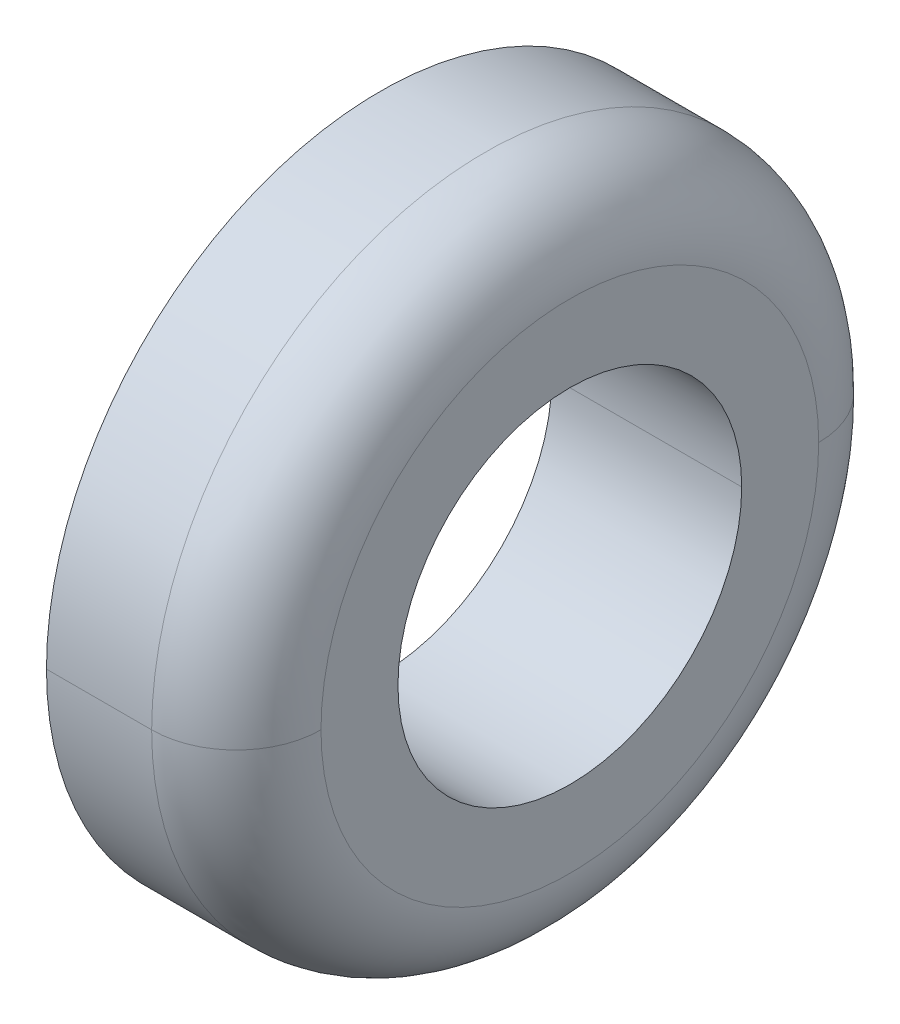
ISO-10303-21;
HEADER;
FILE_DESCRIPTION(('STEP AP214'),'2;1');
FILE_NAME('part.step','',(''),(''),'','','');
FILE_SCHEMA(('AUTOMOTIVE_DESIGN { 1 0 10303 214 1 1 1 1 }'));
ENDSEC;
DATA;
#1=APPLICATION_CONTEXT('core data for automotive mechanical design processes');
#2=APPLICATION_PROTOCOL_DEFINITION('international standard','automotive_design',2000,#1);
#3=PRODUCT_CONTEXT('',#1,'mechanical');
#4=PRODUCT('Part','Part','',(#3));
#5=PRODUCT_RELATED_PRODUCT_CATEGORY('part','',(#4));
#6=PRODUCT_DEFINITION_FORMATION('','',#4);
#7=PRODUCT_DEFINITION_CONTEXT('part definition',#1,'design');
#8=PRODUCT_DEFINITION('design','',#6,#7);
#9=PRODUCT_DEFINITION_SHAPE('','',#8);
#10=(LENGTH_UNIT() NAMED_UNIT(*) SI_UNIT(.MILLI.,.METRE.));
#11=(NAMED_UNIT(*) PLANE_ANGLE_UNIT() SI_UNIT($,.RADIAN.));
#12=(NAMED_UNIT(*) SI_UNIT($,.STERADIAN.) SOLID_ANGLE_UNIT());
#13=UNCERTAINTY_MEASURE_WITH_UNIT(LENGTH_MEASURE(1.E-05),#10,'distance_accuracy_value','');
#14=(GEOMETRIC_REPRESENTATION_CONTEXT(3) GLOBAL_UNCERTAINTY_ASSIGNED_CONTEXT((#13)) GLOBAL_UNIT_ASSIGNED_CONTEXT((#10,
#11,#12)) REPRESENTATION_CONTEXT('',''));
#15=CARTESIAN_POINT('',(0.,0.,0.));
#16=DIRECTION('',(0.,0.,1.));
#17=DIRECTION('',(1.,0.,0.));
#18=AXIS2_PLACEMENT_3D('',#15,#16,#17);
#19=CARTESIAN_POINT('',(0.,0.,0.));
#20=DIRECTION('',(-1.,0.,0.));
#21=DIRECTION('',(0.,0.,1.));
#22=AXIS2_PLACEMENT_3D('',#19,#20,#21);
#23=CYLINDRICAL_SURFACE('',#22,1.675);
#24=DIRECTION('',(1.,0.,0.));
#25=VECTOR('',#24,1.);
#26=CARTESIAN_POINT('',(2.9,0.,-1.675));
#27=LINE('',#26,#25);
#28=CARTESIAN_POINT('',(2.9,0.,-1.675));
#29=VERTEX_POINT('',#28);
#30=CARTESIAN_POINT('',(4.75,0.,-1.675));
#31=VERTEX_POINT('',#30);
#32=EDGE_CURVE('E24',#29,#31,#27,.T.);
#33=ORIENTED_EDGE('',*,*,#32,.F.);
#34=CARTESIAN_POINT('',(2.9,0.,0.));
#35=DIRECTION('',(1.,0.,0.));
#36=DIRECTION('',(0.,0.,1.));
#37=AXIS2_PLACEMENT_3D('',#34,#35,#36);
#38=CIRCLE('',#37,1.675);
#39=CARTESIAN_POINT('',(2.9,0.,1.675));
#40=VERTEX_POINT('',#39);
#41=EDGE_CURVE('E85',#40,#29,#38,.T.);
#42=ORIENTED_EDGE('',*,*,#41,.F.);
#43=DIRECTION('',(1.,0.,0.));
#44=VECTOR('',#43,1.);
#45=CARTESIAN_POINT('',(2.9,0.,1.675));
#46=LINE('',#45,#44);
#47=CARTESIAN_POINT('',(4.75,0.,1.675));
#48=VERTEX_POINT('',#47);
#49=EDGE_CURVE('E11',#40,#48,#46,.T.);
#50=ORIENTED_EDGE('',*,*,#49,.T.);
#51=CARTESIAN_POINT('',(4.75,0.,0.));
#52=DIRECTION('',(-1.,0.,0.));
#53=DIRECTION('',(0.,0.,-1.));
#54=AXIS2_PLACEMENT_3D('',#51,#52,#53);
#55=CIRCLE('',#54,1.675);
#56=EDGE_CURVE('E100',#31,#48,#55,.T.);
#57=ORIENTED_EDGE('',*,*,#56,.F.);
#58=EDGE_LOOP('',(#33,#42,#50,#57));
#59=FACE_BOUND('',#58,.T.);
#60=ADVANCED_FACE('F17',(#59),#23,.F.);
#61=CARTESIAN_POINT('',(0.,0.,0.));
#62=DIRECTION('',(-1.,0.,0.));
#63=DIRECTION('',(0.,0.,1.));
#64=AXIS2_PLACEMENT_3D('',#61,#62,#63);
#65=CYLINDRICAL_SURFACE('',#64,1.675);
#66=CARTESIAN_POINT('',(4.75,0.,0.));
#67=DIRECTION('',(-1.,0.,0.));
#68=DIRECTION('',(0.,0.,1.));
#69=AXIS2_PLACEMENT_3D('',#66,#67,#68);
#70=CIRCLE('',#69,1.675);
#71=EDGE_CURVE('E94',#48,#31,#70,.T.);
#72=ORIENTED_EDGE('',*,*,#71,.F.);
#73=ORIENTED_EDGE('',*,*,#49,.F.);
#74=CARTESIAN_POINT('',(2.9,0.,0.));
#75=DIRECTION('',(1.,0.,0.));
#76=DIRECTION('',(0.,0.,-1.));
#77=AXIS2_PLACEMENT_3D('',#74,#75,#76);
#78=CIRCLE('',#77,1.675);
#79=EDGE_CURVE('E74',#29,#40,#78,.T.);
#80=ORIENTED_EDGE('',*,*,#79,.F.);
#81=ORIENTED_EDGE('',*,*,#32,.T.);
#82=EDGE_LOOP('',(#72,#73,#80,#81));
#83=FACE_BOUND('',#82,.T.);
#84=ADVANCED_FACE('F92',(#83),#65,.F.);
#85=CARTESIAN_POINT('',(2.9,1.675,0.));
#86=DIRECTION('',(1.,0.,0.));
#87=DIRECTION('',(0.,0.,-1.));
#88=AXIS2_PLACEMENT_3D('',#85,#86,#87);
#89=PLANE('',#88);
#90=ORIENTED_EDGE('',*,*,#41,.T.);
#91=ORIENTED_EDGE('',*,*,#79,.T.);
#92=EDGE_LOOP('',(#90,#91));
#93=FACE_BOUND('',#92,.T.);
#94=CARTESIAN_POINT('',(2.9,0.,0.));
#95=DIRECTION('',(-1.,0.,0.));
#96=DIRECTION('',(0.,0.,-1.));
#97=AXIS2_PLACEMENT_3D('',#94,#95,#96);
#98=CIRCLE('',#97,3.25);
#99=CARTESIAN_POINT('',(2.9,0.,-3.25));
#100=VERTEX_POINT('',#99);
#101=CARTESIAN_POINT('',(2.9,0.,3.25));
#102=VERTEX_POINT('',#101);
#103=EDGE_CURVE('E63',#100,#102,#98,.T.);
#104=ORIENTED_EDGE('',*,*,#103,.T.);
#105=CARTESIAN_POINT('',(2.9,0.,0.));
#106=DIRECTION('',(-1.,0.,0.));
#107=DIRECTION('',(0.,0.,1.));
#108=AXIS2_PLACEMENT_3D('',#105,#106,#107);
#109=CIRCLE('',#108,3.25);
#110=EDGE_CURVE('E66',#102,#100,#109,.T.);
#111=ORIENTED_EDGE('',*,*,#110,.T.);
#112=EDGE_LOOP('',(#104,#111));
#113=FACE_BOUND('',#112,.T.);
#114=ADVANCED_FACE('F65',(#93,#113),#89,.F.);
#115=CARTESIAN_POINT('',(0.,0.,0.));
#116=DIRECTION('',(-1.,0.,0.));
#117=DIRECTION('',(0.,0.,1.));
#118=AXIS2_PLACEMENT_3D('',#115,#116,#117);
#119=CYLINDRICAL_SURFACE('',#118,3.25);
#120=DIRECTION('',(1.,0.,0.));
#121=VECTOR('',#120,1.);
#122=CARTESIAN_POINT('',(2.9,0.,-3.25));
#123=LINE('',#122,#121);
#124=CARTESIAN_POINT('',(3.925,0.,-3.25));
#125=VERTEX_POINT('',#124);
#126=EDGE_CURVE('E70',#100,#125,#123,.T.);
#127=ORIENTED_EDGE('',*,*,#126,.F.);
#128=ORIENTED_EDGE('',*,*,#110,.F.);
#129=DIRECTION('',(1.,0.,0.));
#130=VECTOR('',#129,1.);
#131=CARTESIAN_POINT('',(2.9,0.,3.25));
#132=LINE('',#131,#130);
#133=CARTESIAN_POINT('',(3.925,0.,3.25));
#134=VERTEX_POINT('',#133);
#135=EDGE_CURVE('E69',#102,#134,#132,.T.);
#136=ORIENTED_EDGE('',*,*,#135,.T.);
#137=CARTESIAN_POINT('',(3.925,0.,0.));
#138=DIRECTION('',(1.,0.,0.));
#139=DIRECTION('',(0.,0.,-1.));
#140=AXIS2_PLACEMENT_3D('',#137,#138,#139);
#141=CIRCLE('',#140,3.25);
#142=EDGE_CURVE('E39',#125,#134,#141,.T.);
#143=ORIENTED_EDGE('',*,*,#142,.F.);
#144=EDGE_LOOP('',(#127,#128,#136,#143));
#145=FACE_BOUND('',#144,.T.);
#146=ADVANCED_FACE('F72',(#145),#119,.T.);
#147=CARTESIAN_POINT('',(0.,0.,0.));
#148=DIRECTION('',(-1.,0.,0.));
#149=DIRECTION('',(0.,0.,1.));
#150=AXIS2_PLACEMENT_3D('',#147,#148,#149);
#151=CYLINDRICAL_SURFACE('',#150,3.25);
#152=CARTESIAN_POINT('',(3.925,0.,0.));
#153=DIRECTION('',(1.,0.,0.));
#154=DIRECTION('',(0.,0.,1.));
#155=AXIS2_PLACEMENT_3D('',#152,#153,#154);
#156=CIRCLE('',#155,3.25);
#157=EDGE_CURVE('E77',#134,#125,#156,.T.);
#158=ORIENTED_EDGE('',*,*,#157,.F.);
#159=ORIENTED_EDGE('',*,*,#135,.F.);
#160=ORIENTED_EDGE('',*,*,#103,.F.);
#161=ORIENTED_EDGE('',*,*,#126,.T.);
#162=EDGE_LOOP('',(#158,#159,#160,#161));
#163=FACE_BOUND('',#162,.T.);
#164=ADVANCED_FACE('F76',(#163),#151,.T.);
#165=CARTESIAN_POINT('',(3.925,0.,0.));
#166=DIRECTION('',(-1.,0.,0.));
#167=DIRECTION('',(0.,0.,1.));
#168=AXIS2_PLACEMENT_3D('',#165,#166,#167);
#169=TOROIDAL_SURFACE('',#168,2.425,0.824999999999999);
#170=CARTESIAN_POINT('',(4.75,0.,0.));
#171=DIRECTION('',(1.,0.,0.));
#172=DIRECTION('',(0.,0.,1.));
#173=AXIS2_PLACEMENT_3D('',#170,#171,#172);
#174=CIRCLE('',#173,2.4250000560932);
#175=CARTESIAN_POINT('',(4.75,0.,2.4250000560932));
#176=VERTEX_POINT('',#175);
#177=CARTESIAN_POINT('',(4.75,0.,-2.4250000560932));
#178=VERTEX_POINT('',#177);
#179=EDGE_CURVE('E101',#176,#178,#174,.T.);
#180=ORIENTED_EDGE('',*,*,#179,.F.);
#181=CARTESIAN_POINT('',(3.925,0.,2.425));
#182=DIRECTION('',(0.,1.,0.));
#183=DIRECTION('',(0.,0.,1.));
#184=AXIS2_PLACEMENT_3D('',#181,#182,#183);
#185=CIRCLE('',#184,0.824999999999999);
#186=EDGE_CURVE('E103',#134,#176,#185,.T.);
#187=ORIENTED_EDGE('',*,*,#186,.F.);
#188=ORIENTED_EDGE('',*,*,#157,.T.);
#189=CARTESIAN_POINT('',(3.925,0.,-2.425));
#190=DIRECTION('',(0.,-1.,0.));
#191=DIRECTION('',(0.,0.,-1.));
#192=AXIS2_PLACEMENT_3D('',#189,#190,#191);
#193=CIRCLE('',#192,0.824999999999999);
#194=EDGE_CURVE('E31',#125,#178,#193,.T.);
#195=ORIENTED_EDGE('',*,*,#194,.T.);
#196=EDGE_LOOP('',(#180,#187,#188,#195));
#197=FACE_BOUND('',#196,.T.);
#198=ADVANCED_FACE('F113',(#197),#169,.T.);
#199=CARTESIAN_POINT('',(3.925,0.,0.));
#200=DIRECTION('',(-1.,0.,0.));
#201=DIRECTION('',(0.,0.,1.));
#202=AXIS2_PLACEMENT_3D('',#199,#200,#201);
#203=TOROIDAL_SURFACE('',#202,2.425,0.824999999999999);
#204=ORIENTED_EDGE('',*,*,#194,.F.);
#205=ORIENTED_EDGE('',*,*,#142,.T.);
#206=ORIENTED_EDGE('',*,*,#186,.T.);
#207=CARTESIAN_POINT('',(4.75,0.,0.));
#208=DIRECTION('',(1.,0.,0.));
#209=DIRECTION('',(0.,0.,-1.));
#210=AXIS2_PLACEMENT_3D('',#207,#208,#209);
#211=CIRCLE('',#210,2.4250000560932);
#212=EDGE_CURVE('E106',#178,#176,#211,.T.);
#213=ORIENTED_EDGE('',*,*,#212,.F.);
#214=EDGE_LOOP('',(#204,#205,#206,#213));
#215=FACE_BOUND('',#214,.T.);
#216=ADVANCED_FACE('F115',(#215),#203,.T.);
#217=CARTESIAN_POINT('',(4.75,2.4250000560932,0.));
#218=DIRECTION('',(-1.,0.,0.));
#219=DIRECTION('',(0.,0.,1.));
#220=AXIS2_PLACEMENT_3D('',#217,#218,#219);
#221=PLANE('',#220);
#222=ORIENTED_EDGE('',*,*,#56,.T.);
#223=ORIENTED_EDGE('',*,*,#71,.T.);
#224=EDGE_LOOP('',(#222,#223));
#225=FACE_BOUND('',#224,.T.);
#226=ORIENTED_EDGE('',*,*,#179,.T.);
#227=ORIENTED_EDGE('',*,*,#212,.T.);
#228=EDGE_LOOP('',(#226,#227));
#229=FACE_BOUND('',#228,.T.);
#230=ADVANCED_FACE('F98',(#225,#229),#221,.F.);
#231=CLOSED_SHELL('',(#60,#84,#114,#146,#164,#198,#216,#230));
#232=MANIFOLD_SOLID_BREP('B1',#231);
#233=ADVANCED_BREP_SHAPE_REPRESENTATION('',(#18,#232),#14);
#234=SHAPE_DEFINITION_REPRESENTATION(#9,#233);
ENDSEC;
END-ISO-10303-21;
